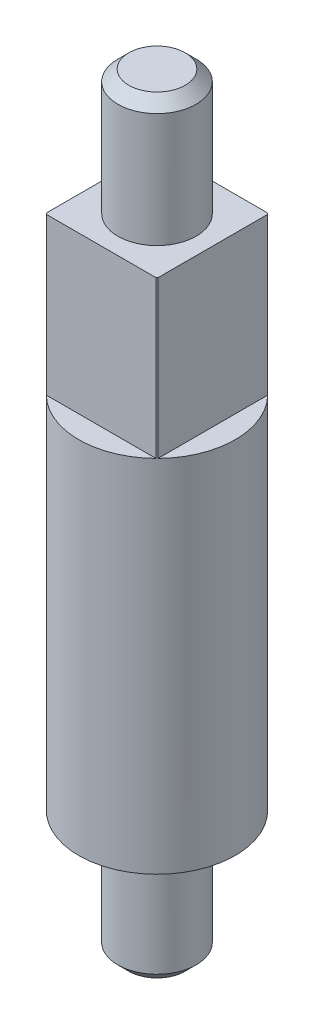
ISO-10303-21;
HEADER;
FILE_DESCRIPTION(('STEP AP214'),'2;1');
FILE_NAME('part.step','',(''),(''),'','','');
FILE_SCHEMA(('AUTOMOTIVE_DESIGN { 1 0 10303 214 1 1 1 1 }'));
ENDSEC;
DATA;
#1=APPLICATION_CONTEXT('core data for automotive mechanical design processes');
#2=APPLICATION_PROTOCOL_DEFINITION('international standard','automotive_design',2000,#1);
#3=PRODUCT_CONTEXT('',#1,'mechanical');
#4=PRODUCT('Part','Part','',(#3));
#5=PRODUCT_RELATED_PRODUCT_CATEGORY('part','',(#4));
#6=PRODUCT_DEFINITION_FORMATION('','',#4);
#7=PRODUCT_DEFINITION_CONTEXT('part definition',#1,'design');
#8=PRODUCT_DEFINITION('design','',#6,#7);
#9=PRODUCT_DEFINITION_SHAPE('','',#8);
#10=(LENGTH_UNIT() NAMED_UNIT(*) SI_UNIT(.MILLI.,.METRE.));
#11=(NAMED_UNIT(*) PLANE_ANGLE_UNIT() SI_UNIT($,.RADIAN.));
#12=(NAMED_UNIT(*) SI_UNIT($,.STERADIAN.) SOLID_ANGLE_UNIT());
#13=UNCERTAINTY_MEASURE_WITH_UNIT(LENGTH_MEASURE(1.E-05),#10,'distance_accuracy_value','');
#14=(GEOMETRIC_REPRESENTATION_CONTEXT(3) GLOBAL_UNCERTAINTY_ASSIGNED_CONTEXT((#13)) GLOBAL_UNIT_ASSIGNED_CONTEXT((#10,
#11,#12)) REPRESENTATION_CONTEXT('',''));
#15=CARTESIAN_POINT('',(0.,0.,0.));
#16=DIRECTION('',(0.,0.,1.));
#17=DIRECTION('',(1.,0.,0.));
#18=AXIS2_PLACEMENT_3D('',#15,#16,#17);
#19=CARTESIAN_POINT('',(0.,0.,0.));
#20=DIRECTION('',(0.,1.,0.));
#21=DIRECTION('',(1.,0.,0.));
#22=AXIS2_PLACEMENT_3D('',#19,#20,#21);
#23=PLANE('',#22);
#24=CARTESIAN_POINT('',(0.,0.,0.));
#25=DIRECTION('',(0.,1.,0.));
#26=DIRECTION('',(0.,0.,-1.));
#27=AXIS2_PLACEMENT_3D('',#24,#25,#26);
#28=CIRCLE('',#27,1.79997483235714);
#29=CARTESIAN_POINT('',(0.,0.,1.79997483235714));
#30=VERTEX_POINT('',#29);
#31=EDGE_CURVE('E244',#30,#30,#28,.T.);
#32=ORIENTED_EDGE('',*,*,#31,.F.);
#33=EDGE_LOOP('',(#32));
#34=FACE_BOUND('',#33,.T.);
#35=ADVANCED_FACE('F17',(#34),#23,.F.);
#36=CARTESIAN_POINT('',(-3.570714214271,41.,3.5));
#37=DIRECTION('',(1.,0.,0.));
#38=DIRECTION('',(0.,1.,0.));
#39=AXIS2_PLACEMENT_3D('',#36,#37,#38);
#40=PLANE('',#39);
#41=DIRECTION('',(0.,0.,-1.));
#42=VECTOR('',#41,1.);
#43=CARTESIAN_POINT('',(-3.570714214271,41.,3.5));
#44=LINE('',#43,#42);
#45=CARTESIAN_POINT('',(-3.570714214271,41.,3.5));
#46=VERTEX_POINT('',#45);
#47=CARTESIAN_POINT('',(-3.570714214271,41.,-3.5));
#48=VERTEX_POINT('',#47);
#49=EDGE_CURVE('E138',#46,#48,#44,.T.);
#50=ORIENTED_EDGE('',*,*,#49,.T.);
#51=DIRECTION('',(0.,1.,0.));
#52=VECTOR('',#51,1.);
#53=CARTESIAN_POINT('',(-3.570714214271,31.,-3.5));
#54=LINE('',#53,#52);
#55=CARTESIAN_POINT('',(-3.570714214271,31.,-3.5));
#56=VERTEX_POINT('',#55);
#57=EDGE_CURVE('E253',#56,#48,#54,.T.);
#58=ORIENTED_EDGE('',*,*,#57,.F.);
#59=DIRECTION('',(0.,0.,-1.));
#60=VECTOR('',#59,1.);
#61=CARTESIAN_POINT('',(-3.570714214271,31.,3.5));
#62=LINE('',#61,#60);
#63=CARTESIAN_POINT('',(-3.570714214271,31.,3.5));
#64=VERTEX_POINT('',#63);
#65=EDGE_CURVE('E155',#64,#56,#62,.T.);
#66=ORIENTED_EDGE('',*,*,#65,.F.);
#67=DIRECTION('',(0.,1.,0.));
#68=VECTOR('',#67,1.);
#69=CARTESIAN_POINT('',(-3.570714214271,31.,3.5));
#70=LINE('',#69,#68);
#71=EDGE_CURVE('E153',#64,#46,#70,.T.);
#72=ORIENTED_EDGE('',*,*,#71,.T.);
#73=EDGE_LOOP('',(#50,#58,#66,#72));
#74=FACE_BOUND('',#73,.T.);
#75=ADVANCED_FACE('F154',(#74),#40,.F.);
#76=CARTESIAN_POINT('',(-3.5,41.,-3.570714214271));
#77=DIRECTION('',(0.,0.,1.));
#78=DIRECTION('',(1.,0.,0.));
#79=AXIS2_PLACEMENT_3D('',#76,#77,#78);
#80=PLANE('',#79);
#81=DIRECTION('',(0.,1.,0.));
#82=VECTOR('',#81,1.);
#83=CARTESIAN_POINT('',(3.5,31.,-3.570714214271));
#84=LINE('',#83,#82);
#85=CARTESIAN_POINT('',(3.5,31.,-3.570714214271));
#86=VERTEX_POINT('',#85);
#87=CARTESIAN_POINT('',(3.5,41.,-3.570714214271));
#88=VERTEX_POINT('',#87);
#89=EDGE_CURVE('E213',#86,#88,#84,.T.);
#90=ORIENTED_EDGE('',*,*,#89,.F.);
#91=DIRECTION('',(1.,0.,0.));
#92=VECTOR('',#91,1.);
#93=CARTESIAN_POINT('',(-3.5,31.,-3.570714214271));
#94=LINE('',#93,#92);
#95=CARTESIAN_POINT('',(-3.5,31.,-3.570714214271));
#96=VERTEX_POINT('',#95);
#97=EDGE_CURVE('E11',#96,#86,#94,.T.);
#98=ORIENTED_EDGE('',*,*,#97,.F.);
#99=DIRECTION('',(0.,1.,0.));
#100=VECTOR('',#99,1.);
#101=CARTESIAN_POINT('',(-3.5,31.,-3.570714214271));
#102=LINE('',#101,#100);
#103=CARTESIAN_POINT('',(-3.5,41.,-3.570714214271));
#104=VERTEX_POINT('',#103);
#105=EDGE_CURVE('E227',#96,#104,#102,.T.);
#106=ORIENTED_EDGE('',*,*,#105,.T.);
#107=DIRECTION('',(1.,0.,0.));
#108=VECTOR('',#107,1.);
#109=CARTESIAN_POINT('',(-3.5,41.,-3.570714214271));
#110=LINE('',#109,#108);
#111=EDGE_CURVE('E150',#104,#88,#110,.T.);
#112=ORIENTED_EDGE('',*,*,#111,.T.);
#113=EDGE_LOOP('',(#90,#98,#106,#112));
#114=FACE_BOUND('',#113,.T.);
#115=ADVANCED_FACE('F416',(#114),#80,.F.);
#116=CARTESIAN_POINT('',(0.,31.,0.));
#117=DIRECTION('',(0.,1.,0.));
#118=DIRECTION('',(1.,0.,0.));
#119=AXIS2_PLACEMENT_3D('',#116,#117,#118);
#120=PLANE('',#119);
#121=CARTESIAN_POINT('',(0.,31.,0.));
#122=DIRECTION('',(0.,1.,0.));
#123=DIRECTION('',(-0.7,0.,0.714142842854292));
#124=AXIS2_PLACEMENT_3D('',#121,#122,#123);
#125=CIRCLE('',#124,5.);
#126=CARTESIAN_POINT('',(-3.5,31.,3.570714214271));
#127=VERTEX_POINT('',#126);
#128=CARTESIAN_POINT('',(3.5,31.,3.570714214271));
#129=VERTEX_POINT('',#128);
#130=EDGE_CURVE('E173',#127,#129,#125,.T.);
#131=ORIENTED_EDGE('',*,*,#130,.T.);
#132=DIRECTION('',(-1.,0.,0.));
#133=VECTOR('',#132,1.);
#134=CARTESIAN_POINT('',(3.5,31.,3.570714214271));
#135=LINE('',#134,#133);
#136=EDGE_CURVE('E28',#129,#127,#135,.T.);
#137=ORIENTED_EDGE('',*,*,#136,.T.);
#138=EDGE_LOOP('',(#131,#137));
#139=FACE_BOUND('',#138,.T.);
#140=ADVANCED_FACE('F479',(#139),#120,.T.);
#141=CARTESIAN_POINT('',(0.,31.,0.));
#142=DIRECTION('',(0.,1.,0.));
#143=DIRECTION('',(1.,0.,0.));
#144=AXIS2_PLACEMENT_3D('',#141,#142,#143);
#145=PLANE('',#144);
#146=CARTESIAN_POINT('',(0.,31.,0.));
#147=DIRECTION('',(0.,1.,0.));
#148=DIRECTION('',(0.7,0.,-0.714142842854292));
#149=AXIS2_PLACEMENT_3D('',#146,#147,#148);
#150=CIRCLE('',#149,5.);
#151=EDGE_CURVE('E176',#86,#96,#150,.T.);
#152=ORIENTED_EDGE('',*,*,#151,.T.);
#153=ORIENTED_EDGE('',*,*,#97,.T.);
#154=EDGE_LOOP('',(#152,#153));
#155=FACE_BOUND('',#154,.T.);
#156=ADVANCED_FACE('F456',(#155),#145,.T.);
#157=CARTESIAN_POINT('',(3.5,41.,3.570714214271));
#158=DIRECTION('',(0.,0.,-1.));
#159=DIRECTION('',(0.,-1.,0.));
#160=AXIS2_PLACEMENT_3D('',#157,#158,#159);
#161=PLANE('',#160);
#162=DIRECTION('',(-1.,0.,0.));
#163=VECTOR('',#162,1.);
#164=CARTESIAN_POINT('',(3.5,41.,3.570714214271));
#165=LINE('',#164,#163);
#166=CARTESIAN_POINT('',(3.5,41.,3.570714214271));
#167=VERTEX_POINT('',#166);
#168=CARTESIAN_POINT('',(-3.5,41.,3.570714214271));
#169=VERTEX_POINT('',#168);
#170=EDGE_CURVE('E21',#167,#169,#165,.T.);
#171=ORIENTED_EDGE('',*,*,#170,.T.);
#172=DIRECTION('',(0.,1.,0.));
#173=VECTOR('',#172,1.);
#174=CARTESIAN_POINT('',(-3.5,31.,3.570714214271));
#175=LINE('',#174,#173);
#176=EDGE_CURVE('E166',#127,#169,#175,.T.);
#177=ORIENTED_EDGE('',*,*,#176,.F.);
#178=ORIENTED_EDGE('',*,*,#136,.F.);
#179=DIRECTION('',(0.,1.,0.));
#180=VECTOR('',#179,1.);
#181=CARTESIAN_POINT('',(3.5,31.,3.570714214271));
#182=LINE('',#181,#180);
#183=EDGE_CURVE('E196',#129,#167,#182,.T.);
#184=ORIENTED_EDGE('',*,*,#183,.T.);
#185=EDGE_LOOP('',(#171,#177,#178,#184));
#186=FACE_BOUND('',#185,.T.);
#187=ADVANCED_FACE('F451',(#186),#161,.F.);
#188=CARTESIAN_POINT('',(0.,49.,0.));
#189=DIRECTION('',(0.,1.,0.));
#190=DIRECTION('',(1.,0.,0.));
#191=AXIS2_PLACEMENT_3D('',#188,#189,#190);
#192=PLANE('',#191);
#193=CARTESIAN_POINT('',(0.,49.,0.));
#194=DIRECTION('',(0.,1.,0.));
#195=DIRECTION('',(0.,0.,-1.));
#196=AXIS2_PLACEMENT_3D('',#193,#194,#195);
#197=CIRCLE('',#196,1.7999752407317);
#198=CARTESIAN_POINT('',(0.,49.,1.7999752407317));
#199=VERTEX_POINT('',#198);
#200=EDGE_CURVE('E40',#199,#199,#197,.T.);
#201=ORIENTED_EDGE('',*,*,#200,.T.);
#202=EDGE_LOOP('',(#201));
#203=FACE_BOUND('',#202,.T.);
#204=ADVANCED_FACE('F437',(#203),#192,.T.);
#205=CARTESIAN_POINT('',(0.,48.64998273624,0.));
#206=DIRECTION('',(0.,-1.,0.));
#207=DIRECTION('',(0.,0.,-1.));
#208=AXIS2_PLACEMENT_3D('',#205,#206,#207);
#209=CONICAL_SURFACE('',#208,2.149987689952,0.785391285775513);
#210=CARTESIAN_POINT('',(0.,48.2999656116542,0.));
#211=DIRECTION('',(0.,1.,0.));
#212=DIRECTION('',(1.,0.,0.));
#213=AXIS2_PLACEMENT_3D('',#210,#211,#212);
#214=CIRCLE('',#213,2.5);
#215=CARTESIAN_POINT('',(-2.5,48.2999656116542,0.));
#216=VERTEX_POINT('',#215);
#217=CARTESIAN_POINT('',(0.,48.2999656116542,2.5));
#218=VERTEX_POINT('',#217);
#219=EDGE_CURVE('E191',#216,#218,#214,.T.);
#220=ORIENTED_EDGE('',*,*,#219,.T.);
#221=DIRECTION('',(0.,0.707111644382933,-0.707101917956715));
#222=VECTOR('',#221,1.);
#223=CARTESIAN_POINT('',(0.,48.64998273624,2.149987689952));
#224=LINE('',#223,#222);
#225=EDGE_CURVE('E201',#218,#199,#224,.T.);
#226=ORIENTED_EDGE('',*,*,#225,.T.);
#227=ORIENTED_EDGE('',*,*,#200,.F.);
#228=ORIENTED_EDGE('',*,*,#225,.F.);
#229=CARTESIAN_POINT('',(0.,48.2999656116542,0.));
#230=DIRECTION('',(0.,1.,0.));
#231=DIRECTION('',(1.,0.,0.));
#232=AXIS2_PLACEMENT_3D('',#229,#230,#231);
#233=CIRCLE('',#232,2.5);
#234=EDGE_CURVE('E198',#218,#216,#233,.T.);
#235=ORIENTED_EDGE('',*,*,#234,.T.);
#236=EDGE_LOOP('',(#220,#226,#227,#228,#235));
#237=FACE_BOUND('',#236,.T.);
#238=ADVANCED_FACE('F432',(#237),#209,.T.);
#239=CARTESIAN_POINT('',(0.,-2.45,0.));
#240=DIRECTION('',(0.,1.,0.));
#241=DIRECTION('',(1.,0.,0.));
#242=AXIS2_PLACEMENT_3D('',#239,#240,#241);
#243=CYLINDRICAL_SURFACE('',#242,2.5);
#244=ORIENTED_EDGE('',*,*,#219,.F.);
#245=DIRECTION('',(0.,-1.,0.));
#246=VECTOR('',#245,1.);
#247=CARTESIAN_POINT('',(-2.5,-2.45,0.));
#248=LINE('',#247,#246);
#249=CARTESIAN_POINT('',(-2.5,41.,0.));
#250=VERTEX_POINT('',#249);
#251=EDGE_CURVE('E202',#216,#250,#248,.T.);
#252=ORIENTED_EDGE('',*,*,#251,.T.);
#253=CARTESIAN_POINT('',(0.,41.,0.));
#254=DIRECTION('',(0.,1.,0.));
#255=DIRECTION('',(1.,0.,0.));
#256=AXIS2_PLACEMENT_3D('',#253,#254,#255);
#257=CIRCLE('',#256,2.5);
#258=EDGE_CURVE('E187',#250,#250,#257,.T.);
#259=ORIENTED_EDGE('',*,*,#258,.T.);
#260=ORIENTED_EDGE('',*,*,#251,.F.);
#261=ORIENTED_EDGE('',*,*,#234,.F.);
#262=EDGE_LOOP('',(#244,#252,#259,#260,#261));
#263=FACE_BOUND('',#262,.T.);
#264=ADVANCED_FACE('F386',(#263),#243,.T.);
#265=CARTESIAN_POINT('',(0.,41.,0.));
#266=DIRECTION('',(0.,1.,0.));
#267=DIRECTION('',(1.,0.,0.));
#268=AXIS2_PLACEMENT_3D('',#265,#266,#267);
#269=PLANE('',#268);
#270=ORIENTED_EDGE('',*,*,#258,.F.);
#271=EDGE_LOOP('',(#270));
#272=FACE_BOUND('',#271,.T.);
#273=DIRECTION('',(0.,0.,1.));
#274=VECTOR('',#273,1.);
#275=CARTESIAN_POINT('',(3.570714214271,41.,-3.5));
#276=LINE('',#275,#274);
#277=CARTESIAN_POINT('',(3.570714214271,41.,-3.5));
#278=VERTEX_POINT('',#277);
#279=CARTESIAN_POINT('',(3.570714214271,41.,3.5));
#280=VERTEX_POINT('',#279);
#281=EDGE_CURVE('E221',#278,#280,#276,.T.);
#282=ORIENTED_EDGE('',*,*,#281,.F.);
#283=CARTESIAN_POINT('',(0.,41.,0.));
#284=DIRECTION('',(0.,1.,0.));
#285=DIRECTION('',(0.714142842854292,0.,-0.7));
#286=AXIS2_PLACEMENT_3D('',#283,#284,#285);
#287=CIRCLE('',#286,5.);
#288=EDGE_CURVE('E208',#278,#88,#287,.T.);
#289=ORIENTED_EDGE('',*,*,#288,.T.);
#290=ORIENTED_EDGE('',*,*,#111,.F.);
#291=CARTESIAN_POINT('',(0.,41.,0.));
#292=DIRECTION('',(0.,1.,0.));
#293=DIRECTION('',(-0.7,0.,-0.714142842854292));
#294=AXIS2_PLACEMENT_3D('',#291,#292,#293);
#295=CIRCLE('',#294,5.);
#296=EDGE_CURVE('E145',#104,#48,#295,.T.);
#297=ORIENTED_EDGE('',*,*,#296,.T.);
#298=ORIENTED_EDGE('',*,*,#49,.F.);
#299=CARTESIAN_POINT('',(0.,41.,0.));
#300=DIRECTION('',(0.,-1.,0.));
#301=DIRECTION('',(-0.7,0.,0.714142842854292));
#302=AXIS2_PLACEMENT_3D('',#299,#300,#301);
#303=CIRCLE('',#302,5.);
#304=EDGE_CURVE('E142',#169,#46,#303,.T.);
#305=ORIENTED_EDGE('',*,*,#304,.F.);
#306=ORIENTED_EDGE('',*,*,#170,.F.);
#307=CARTESIAN_POINT('',(0.,41.,0.));
#308=DIRECTION('',(0.,-1.,0.));
#309=DIRECTION('',(0.714142842854292,0.,0.7));
#310=AXIS2_PLACEMENT_3D('',#307,#308,#309);
#311=CIRCLE('',#310,5.);
#312=EDGE_CURVE('E192',#280,#167,#311,.T.);
#313=ORIENTED_EDGE('',*,*,#312,.F.);
#314=EDGE_LOOP('',(#282,#289,#290,#297,#298,#305,#306,#313));
#315=FACE_BOUND('',#314,.T.);
#316=ADVANCED_FACE('F140',(#272,#315),#269,.T.);
#317=CARTESIAN_POINT('',(3.570714214271,41.,-3.5));
#318=DIRECTION('',(-1.,0.,0.));
#319=DIRECTION('',(0.,0.,1.));
#320=AXIS2_PLACEMENT_3D('',#317,#318,#319);
#321=PLANE('',#320);
#322=ORIENTED_EDGE('',*,*,#281,.T.);
#323=DIRECTION('',(0.,1.,0.));
#324=VECTOR('',#323,1.);
#325=CARTESIAN_POINT('',(3.570714214271,31.,3.5));
#326=LINE('',#325,#324);
#327=CARTESIAN_POINT('',(3.570714214271,31.,3.5));
#328=VERTEX_POINT('',#327);
#329=EDGE_CURVE('E197',#328,#280,#326,.T.);
#330=ORIENTED_EDGE('',*,*,#329,.F.);
#331=DIRECTION('',(0.,0.,1.));
#332=VECTOR('',#331,1.);
#333=CARTESIAN_POINT('',(3.570714214271,31.,-3.5));
#334=LINE('',#333,#332);
#335=CARTESIAN_POINT('',(3.570714214271,31.,-3.5));
#336=VERTEX_POINT('',#335);
#337=EDGE_CURVE('E259',#336,#328,#334,.T.);
#338=ORIENTED_EDGE('',*,*,#337,.F.);
#339=DIRECTION('',(0.,1.,0.));
#340=VECTOR('',#339,1.);
#341=CARTESIAN_POINT('',(3.570714214271,31.,-3.5));
#342=LINE('',#341,#340);
#343=EDGE_CURVE('E212',#336,#278,#342,.T.);
#344=ORIENTED_EDGE('',*,*,#343,.T.);
#345=EDGE_LOOP('',(#322,#330,#338,#344));
#346=FACE_BOUND('',#345,.T.);
#347=ADVANCED_FACE('F385',(#346),#321,.F.);
#348=CARTESIAN_POINT('',(0.,31.,0.));
#349=DIRECTION('',(0.,1.,0.));
#350=DIRECTION('',(1.,0.,0.));
#351=AXIS2_PLACEMENT_3D('',#348,#349,#350);
#352=PLANE('',#351);
#353=CARTESIAN_POINT('',(0.,31.,0.));
#354=DIRECTION('',(0.,1.,0.));
#355=DIRECTION('',(-0.714142842854292,0.,-0.7));
#356=AXIS2_PLACEMENT_3D('',#353,#354,#355);
#357=CIRCLE('',#356,5.);
#358=CARTESIAN_POINT('',(-5.,31.,0.));
#359=VERTEX_POINT('',#358);
#360=EDGE_CURVE('E249',#56,#359,#357,.T.);
#361=ORIENTED_EDGE('',*,*,#360,.T.);
#362=CARTESIAN_POINT('',(0.,31.,0.));
#363=DIRECTION('',(0.,1.,0.));
#364=DIRECTION('',(-0.714142842854292,0.,-0.7));
#365=AXIS2_PLACEMENT_3D('',#362,#363,#364);
#366=CIRCLE('',#365,5.);
#367=EDGE_CURVE('E160',#359,#64,#366,.T.);
#368=ORIENTED_EDGE('',*,*,#367,.T.);
#369=ORIENTED_EDGE('',*,*,#65,.T.);
#370=EDGE_LOOP('',(#361,#368,#369));
#371=FACE_BOUND('',#370,.T.);
#372=ADVANCED_FACE('F421',(#371),#352,.T.);
#373=CARTESIAN_POINT('',(0.,31.,0.));
#374=DIRECTION('',(0.,1.,0.));
#375=DIRECTION('',(1.,0.,0.));
#376=AXIS2_PLACEMENT_3D('',#373,#374,#375);
#377=PLANE('',#376);
#378=CARTESIAN_POINT('',(0.,31.,0.));
#379=DIRECTION('',(0.,1.,0.));
#380=DIRECTION('',(0.714142842854292,0.,0.7));
#381=AXIS2_PLACEMENT_3D('',#378,#379,#380);
#382=CIRCLE('',#381,5.);
#383=EDGE_CURVE('E240',#328,#336,#382,.T.);
#384=ORIENTED_EDGE('',*,*,#383,.T.);
#385=ORIENTED_EDGE('',*,*,#337,.T.);
#386=EDGE_LOOP('',(#384,#385));
#387=FACE_BOUND('',#386,.T.);
#388=ADVANCED_FACE('F426',(#387),#377,.T.);
#389=CARTESIAN_POINT('',(0.,-2.45,0.));
#390=DIRECTION('',(0.,1.,0.));
#391=DIRECTION('',(1.,0.,0.));
#392=AXIS2_PLACEMENT_3D('',#389,#390,#391);
#393=CYLINDRICAL_SURFACE('',#392,5.);
#394=ORIENTED_EDGE('',*,*,#360,.F.);
#395=ORIENTED_EDGE('',*,*,#57,.T.);
#396=ORIENTED_EDGE('',*,*,#296,.F.);
#397=ORIENTED_EDGE('',*,*,#105,.F.);
#398=ORIENTED_EDGE('',*,*,#151,.F.);
#399=ORIENTED_EDGE('',*,*,#89,.T.);
#400=ORIENTED_EDGE('',*,*,#288,.F.);
#401=ORIENTED_EDGE('',*,*,#343,.F.);
#402=ORIENTED_EDGE('',*,*,#383,.F.);
#403=ORIENTED_EDGE('',*,*,#329,.T.);
#404=ORIENTED_EDGE('',*,*,#312,.T.);
#405=ORIENTED_EDGE('',*,*,#183,.F.);
#406=ORIENTED_EDGE('',*,*,#130,.F.);
#407=ORIENTED_EDGE('',*,*,#176,.T.);
#408=ORIENTED_EDGE('',*,*,#304,.T.);
#409=ORIENTED_EDGE('',*,*,#71,.F.);
#410=ORIENTED_EDGE('',*,*,#367,.F.);
#411=DIRECTION('',(0.,-1.,0.));
#412=VECTOR('',#411,1.);
#413=CARTESIAN_POINT('',(-5.,-2.45,0.));
#414=LINE('',#413,#412);
#415=CARTESIAN_POINT('',(-5.,8.,0.));
#416=VERTEX_POINT('',#415);
#417=EDGE_CURVE('E180',#359,#416,#414,.T.);
#418=ORIENTED_EDGE('',*,*,#417,.T.);
#419=CARTESIAN_POINT('',(0.,8.,0.));
#420=DIRECTION('',(0.,1.,0.));
#421=DIRECTION('',(1.,0.,0.));
#422=AXIS2_PLACEMENT_3D('',#419,#420,#421);
#423=CIRCLE('',#422,5.);
#424=EDGE_CURVE('E245',#416,#416,#423,.T.);
#425=ORIENTED_EDGE('',*,*,#424,.T.);
#426=ORIENTED_EDGE('',*,*,#417,.F.);
#427=EDGE_LOOP('',(#394,#395,#396,#397,#398,#399,#400,#401,#402,#403,#404,#405,#406,#407,#408,
#409,#410,#418,#425,#426));
#428=FACE_BOUND('',#427,.T.);
#429=ADVANCED_FACE('F163',(#428),#393,.T.);
#430=CARTESIAN_POINT('',(0.,8.,0.));
#431=DIRECTION('',(0.,1.,0.));
#432=DIRECTION('',(1.,0.,0.));
#433=AXIS2_PLACEMENT_3D('',#430,#431,#432);
#434=PLANE('',#433);
#435=CARTESIAN_POINT('',(0.,8.,0.));
#436=DIRECTION('',(0.,1.,0.));
#437=DIRECTION('',(1.,0.,0.));
#438=AXIS2_PLACEMENT_3D('',#435,#436,#437);
#439=CIRCLE('',#438,2.5);
#440=CARTESIAN_POINT('',(-2.5,8.,0.));
#441=VERTEX_POINT('',#440);
#442=EDGE_CURVE('E203',#441,#441,#439,.T.);
#443=ORIENTED_EDGE('',*,*,#442,.T.);
#444=EDGE_LOOP('',(#443));
#445=FACE_BOUND('',#444,.T.);
#446=ORIENTED_EDGE('',*,*,#424,.F.);
#447=EDGE_LOOP('',(#446));
#448=FACE_BOUND('',#447,.T.);
#449=ADVANCED_FACE('F19',(#445,#448),#434,.F.);
#450=CARTESIAN_POINT('',(0.,0.3500169408581,0.));
#451=DIRECTION('',(0.,1.,0.));
#452=DIRECTION('',(0.,0.,-1.));
#453=AXIS2_PLACEMENT_3D('',#450,#451,#452);
#454=CONICAL_SURFACE('',#453,2.14998687927,0.785391172336616);
#455=CARTESIAN_POINT('',(0.,0.700034955548352,0.));
#456=DIRECTION('',(0.,1.,0.));
#457=DIRECTION('',(1.,0.,0.));
#458=AXIS2_PLACEMENT_3D('',#455,#456,#457);
#459=CIRCLE('',#458,2.5);
#460=CARTESIAN_POINT('',(0.,0.700034955548352,2.5));
#461=VERTEX_POINT('',#460);
#462=CARTESIAN_POINT('',(-2.5,0.700034955548352,0.));
#463=VERTEX_POINT('',#462);
#464=EDGE_CURVE('E182',#461,#463,#459,.T.);
#465=ORIENTED_EDGE('',*,*,#464,.F.);
#466=DIRECTION('',(0.,-0.70711172459579,-0.707101837742746));
#467=VECTOR('',#466,1.);
#468=CARTESIAN_POINT('',(0.,0.3500169408581,2.14998687927));
#469=LINE('',#468,#467);
#470=EDGE_CURVE('E185',#461,#30,#469,.T.);
#471=ORIENTED_EDGE('',*,*,#470,.T.);
#472=ORIENTED_EDGE('',*,*,#31,.T.);
#473=ORIENTED_EDGE('',*,*,#470,.F.);
#474=CARTESIAN_POINT('',(0.,0.700034955548352,0.));
#475=DIRECTION('',(0.,1.,0.));
#476=DIRECTION('',(1.,0.,0.));
#477=AXIS2_PLACEMENT_3D('',#474,#475,#476);
#478=CIRCLE('',#477,2.5);
#479=EDGE_CURVE('E186',#463,#461,#478,.T.);
#480=ORIENTED_EDGE('',*,*,#479,.F.);
#481=EDGE_LOOP('',(#465,#471,#472,#473,#480));
#482=FACE_BOUND('',#481,.T.);
#483=ADVANCED_FACE('F398',(#482),#454,.T.);
#484=CARTESIAN_POINT('',(0.,-2.45,0.));
#485=DIRECTION('',(0.,1.,0.));
#486=DIRECTION('',(1.,0.,0.));
#487=AXIS2_PLACEMENT_3D('',#484,#485,#486);
#488=CYLINDRICAL_SURFACE('',#487,2.5);
#489=ORIENTED_EDGE('',*,*,#442,.F.);
#490=DIRECTION('',(0.,-1.,0.));
#491=VECTOR('',#490,1.);
#492=CARTESIAN_POINT('',(-2.5,-2.45,0.));
#493=LINE('',#492,#491);
#494=EDGE_CURVE('E207',#441,#463,#493,.T.);
#495=ORIENTED_EDGE('',*,*,#494,.T.);
#496=ORIENTED_EDGE('',*,*,#479,.T.);
#497=ORIENTED_EDGE('',*,*,#464,.T.);
#498=ORIENTED_EDGE('',*,*,#494,.F.);
#499=EDGE_LOOP('',(#489,#495,#496,#497,#498));
#500=FACE_BOUND('',#499,.T.);
#501=ADVANCED_FACE('F393',(#500),#488,.T.);
#502=CLOSED_SHELL('',(#35,#75,#115,#140,#156,#187,#204,#238,#264,#316,#347,#372,#388,#429,#449,
#483,#501));
#503=MANIFOLD_SOLID_BREP('B1',#502);
#504=ADVANCED_BREP_SHAPE_REPRESENTATION('',(#18,#503),#14);
#505=SHAPE_DEFINITION_REPRESENTATION(#9,#504);
ENDSEC;
END-ISO-10303-21;
